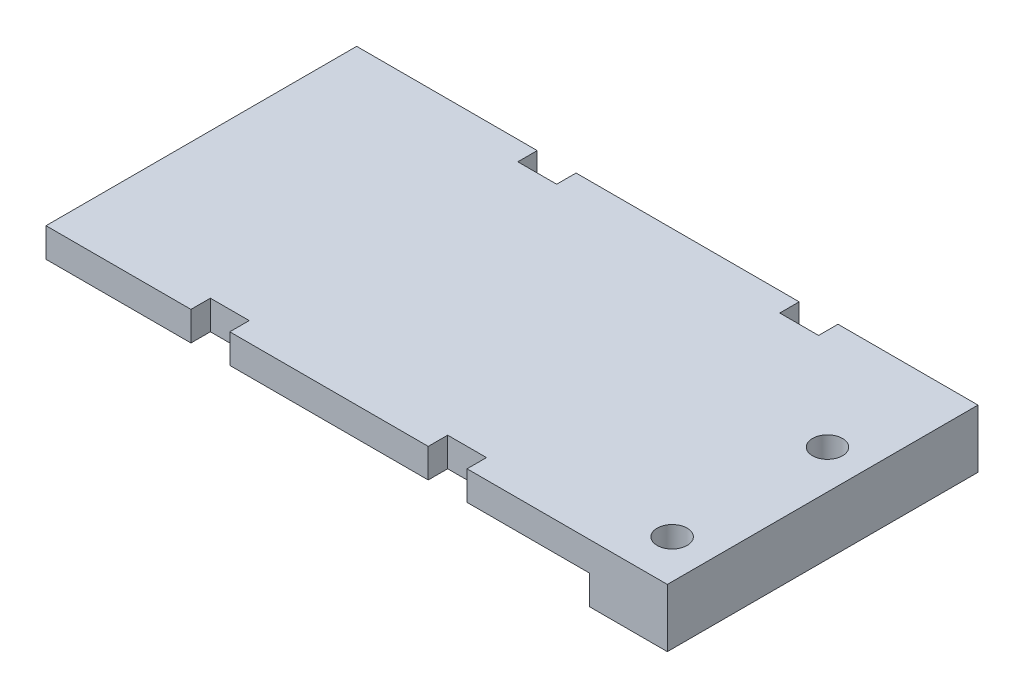
ISO-10303-21;
HEADER;
FILE_DESCRIPTION(('STEP AP214'),'2;1');
FILE_NAME('part.step','',(''),(''),'','','');
FILE_SCHEMA(('AUTOMOTIVE_DESIGN { 1 0 10303 214 1 1 1 1 }'));
ENDSEC;
DATA;
#1=APPLICATION_CONTEXT('core data for automotive mechanical design processes');
#2=APPLICATION_PROTOCOL_DEFINITION('international standard','automotive_design',2000,#1);
#3=PRODUCT_CONTEXT('',#1,'mechanical');
#4=PRODUCT('Part','Part','',(#3));
#5=PRODUCT_RELATED_PRODUCT_CATEGORY('part','',(#4));
#6=PRODUCT_DEFINITION_FORMATION('','',#4);
#7=PRODUCT_DEFINITION_CONTEXT('part definition',#1,'design');
#8=PRODUCT_DEFINITION('design','',#6,#7);
#9=PRODUCT_DEFINITION_SHAPE('','',#8);
#10=(LENGTH_UNIT() NAMED_UNIT(*) SI_UNIT(.MILLI.,.METRE.));
#11=(NAMED_UNIT(*) PLANE_ANGLE_UNIT() SI_UNIT($,.RADIAN.));
#12=(NAMED_UNIT(*) SI_UNIT($,.STERADIAN.) SOLID_ANGLE_UNIT());
#13=UNCERTAINTY_MEASURE_WITH_UNIT(LENGTH_MEASURE(1.E-05),#10,'distance_accuracy_value','');
#14=(GEOMETRIC_REPRESENTATION_CONTEXT(3) GLOBAL_UNCERTAINTY_ASSIGNED_CONTEXT((#13)) GLOBAL_UNIT_ASSIGNED_CONTEXT((#10,
#11,#12)) REPRESENTATION_CONTEXT('',''));
#15=CARTESIAN_POINT('',(0.,0.,0.));
#16=DIRECTION('',(0.,0.,1.));
#17=DIRECTION('',(1.,0.,0.));
#18=AXIS2_PLACEMENT_3D('',#15,#16,#17);
#19=CARTESIAN_POINT('',(-50.8,4.7625,-25.4));
#20=DIRECTION('',(0.,0.,1.));
#21=DIRECTION('',(1.,0.,0.));
#22=AXIS2_PLACEMENT_3D('',#19,#20,#21);
#23=PLANE('',#22);
#24=DIRECTION('',(-1.,0.,0.));
#25=VECTOR('',#24,1.);
#26=CARTESIAN_POINT('',(-50.8,4.7625,-25.4));
#27=LINE('',#26,#25);
#28=CARTESIAN_POINT('',(21.5569089687596,4.7625,-25.4));
#29=VERTEX_POINT('',#28);
#30=CARTESIAN_POINT('',(-14.9241712665832,4.7625,-25.4));
#31=VERTEX_POINT('',#30);
#32=EDGE_CURVE('E309',#29,#31,#27,.T.);
#33=ORIENTED_EDGE('',*,*,#32,.F.);
#34=DIRECTION('',(0.,1.,0.));
#35=VECTOR('',#34,1.);
#36=CARTESIAN_POINT('',(21.5569089687596,-4.7625,-25.4));
#37=LINE('',#36,#35);
#38=CARTESIAN_POINT('',(21.5569089687596,0.,-25.4));
#39=VERTEX_POINT('',#38);
#40=EDGE_CURVE('E205',#39,#29,#37,.T.);
#41=ORIENTED_EDGE('',*,*,#40,.F.);
#42=DIRECTION('',(-1.,0.,0.));
#43=VECTOR('',#42,1.);
#44=CARTESIAN_POINT('',(-50.8,0.,-25.4));
#45=LINE('',#44,#43);
#46=CARTESIAN_POINT('',(-14.9241712665832,0.,-25.4));
#47=VERTEX_POINT('',#46);
#48=EDGE_CURVE('E321',#39,#47,#45,.T.);
#49=ORIENTED_EDGE('',*,*,#48,.T.);
#50=DIRECTION('',(0.,1.,0.));
#51=VECTOR('',#50,1.);
#52=CARTESIAN_POINT('',(-14.9241712665832,-4.7625,-25.4));
#53=LINE('',#52,#51);
#54=EDGE_CURVE('E226',#47,#31,#53,.T.);
#55=ORIENTED_EDGE('',*,*,#54,.T.);
#56=EDGE_LOOP('',(#33,#41,#49,#55));
#57=FACE_BOUND('',#56,.T.);
#58=ADVANCED_FACE('F43',(#57),#23,.F.);
#59=CARTESIAN_POINT('',(-21.2741712665832,4.7625,-25.4));
#60=VERTEX_POINT('',#59);
#61=CARTESIAN_POINT('',(-50.8,4.7625,-25.4));
#62=VERTEX_POINT('',#61);
#63=EDGE_CURVE('E304',#60,#62,#27,.T.);
#64=ORIENTED_EDGE('',*,*,#63,.F.);
#65=DIRECTION('',(0.,1.,0.));
#66=VECTOR('',#65,1.);
#67=CARTESIAN_POINT('',(-21.2741712665832,-4.7625,-25.4));
#68=LINE('',#67,#66);
#69=CARTESIAN_POINT('',(-21.2741712665832,0.,-25.4));
#70=VERTEX_POINT('',#69);
#71=EDGE_CURVE('E229',#70,#60,#68,.T.);
#72=ORIENTED_EDGE('',*,*,#71,.F.);
#73=CARTESIAN_POINT('',(-50.8,0.,-25.4));
#74=VERTEX_POINT('',#73);
#75=EDGE_CURVE('E300',#70,#74,#45,.T.);
#76=ORIENTED_EDGE('',*,*,#75,.T.);
#77=DIRECTION('',(0.,-1.,0.));
#78=VECTOR('',#77,1.);
#79=CARTESIAN_POINT('',(-50.8,4.7625,-25.4));
#80=LINE('',#79,#78);
#81=EDGE_CURVE('E331',#62,#74,#80,.T.);
#82=ORIENTED_EDGE('',*,*,#81,.F.);
#83=EDGE_LOOP('',(#64,#72,#76,#82));
#84=FACE_BOUND('',#83,.T.);
#85=ADVANCED_FACE('F374',(#84),#23,.F.);
#86=CARTESIAN_POINT('',(-50.8,4.7625,25.4));
#87=DIRECTION('',(0.,0.,-1.));
#88=DIRECTION('',(-1.,0.,0.));
#89=AXIS2_PLACEMENT_3D('',#86,#87,#88);
#90=PLANE('',#89);
#91=DIRECTION('',(1.,0.,0.));
#92=VECTOR('',#91,1.);
#93=CARTESIAN_POINT('',(-50.8,0.,25.4));
#94=LINE('',#93,#92);
#95=CARTESIAN_POINT('',(-50.8,0.,25.4));
#96=VERTEX_POINT('',#95);
#97=CARTESIAN_POINT('',(-27.0964168163298,0.,25.4));
#98=VERTEX_POINT('',#97);
#99=EDGE_CURVE('E305',#96,#98,#94,.T.);
#100=ORIENTED_EDGE('',*,*,#99,.T.);
#101=DIRECTION('',(0.,1.,0.));
#102=VECTOR('',#101,1.);
#103=CARTESIAN_POINT('',(-27.0964168163298,-4.7625,25.4));
#104=LINE('',#103,#102);
#105=CARTESIAN_POINT('',(-27.0964168163298,4.7625,25.4));
#106=VERTEX_POINT('',#105);
#107=EDGE_CURVE('E237',#98,#106,#104,.T.);
#108=ORIENTED_EDGE('',*,*,#107,.T.);
#109=DIRECTION('',(1.,0.,0.));
#110=VECTOR('',#109,1.);
#111=CARTESIAN_POINT('',(-50.8,4.7625,25.4));
#112=LINE('',#111,#110);
#113=CARTESIAN_POINT('',(-50.8,4.7625,25.4));
#114=VERTEX_POINT('',#113);
#115=EDGE_CURVE('E312',#114,#106,#112,.T.);
#116=ORIENTED_EDGE('',*,*,#115,.F.);
#117=DIRECTION('',(0.,-1.,0.));
#118=VECTOR('',#117,1.);
#119=CARTESIAN_POINT('',(-50.8,4.7625,25.4));
#120=LINE('',#119,#118);
#121=EDGE_CURVE('E328',#114,#96,#120,.T.);
#122=ORIENTED_EDGE('',*,*,#121,.T.);
#123=EDGE_LOOP('',(#100,#108,#116,#122));
#124=FACE_BOUND('',#123,.T.);
#125=ADVANCED_FACE('F382',(#124),#90,.F.);
#126=CARTESIAN_POINT('',(-20.7464168163298,4.7625,25.4));
#127=VERTEX_POINT('',#126);
#128=CARTESIAN_POINT('',(11.7031032476702,4.7625,25.4));
#129=VERTEX_POINT('',#128);
#130=EDGE_CURVE('E316',#127,#129,#112,.T.);
#131=ORIENTED_EDGE('',*,*,#130,.F.);
#132=DIRECTION('',(0.,1.,0.));
#133=VECTOR('',#132,1.);
#134=CARTESIAN_POINT('',(-20.7464168163298,-4.7625,25.4));
#135=LINE('',#134,#133);
#136=CARTESIAN_POINT('',(-20.7464168163298,0.,25.4));
#137=VERTEX_POINT('',#136);
#138=EDGE_CURVE('E241',#137,#127,#135,.T.);
#139=ORIENTED_EDGE('',*,*,#138,.F.);
#140=CARTESIAN_POINT('',(11.7031032476702,0.,25.4));
#141=VERTEX_POINT('',#140);
#142=EDGE_CURVE('E326',#137,#141,#94,.T.);
#143=ORIENTED_EDGE('',*,*,#142,.T.);
#144=DIRECTION('',(0.,1.,0.));
#145=VECTOR('',#144,1.);
#146=CARTESIAN_POINT('',(11.7031032476702,-4.7625,25.4));
#147=LINE('',#146,#145);
#148=EDGE_CURVE('E254',#141,#129,#147,.T.);
#149=ORIENTED_EDGE('',*,*,#148,.T.);
#150=EDGE_LOOP('',(#131,#139,#143,#149));
#151=FACE_BOUND('',#150,.T.);
#152=ADVANCED_FACE('F401',(#151),#90,.F.);
#153=CARTESIAN_POINT('',(50.8,4.7625,25.4));
#154=DIRECTION('',(-1.,0.,0.));
#155=DIRECTION('',(0.,0.,1.));
#156=AXIS2_PLACEMENT_3D('',#153,#154,#155);
#157=PLANE('',#156);
#158=DIRECTION('',(0.,-1.,0.));
#159=VECTOR('',#158,1.);
#160=CARTESIAN_POINT('',(50.8,4.7625,25.4));
#161=LINE('',#160,#159);
#162=CARTESIAN_POINT('',(50.8,4.7625,25.4));
#163=VERTEX_POINT('',#162);
#164=CARTESIAN_POINT('',(50.8,-4.7625,25.4));
#165=VERTEX_POINT('',#164);
#166=EDGE_CURVE('E315',#163,#165,#161,.T.);
#167=ORIENTED_EDGE('',*,*,#166,.T.);
#168=DIRECTION('',(0.,0.,1.));
#169=VECTOR('',#168,1.);
#170=CARTESIAN_POINT('',(50.8,-4.7625,25.4));
#171=LINE('',#170,#169);
#172=CARTESIAN_POINT('',(50.8,-4.7625,-25.4));
#173=VERTEX_POINT('',#172);
#174=EDGE_CURVE('E282',#173,#165,#171,.T.);
#175=ORIENTED_EDGE('',*,*,#174,.F.);
#176=DIRECTION('',(0.,-1.,0.));
#177=VECTOR('',#176,1.);
#178=CARTESIAN_POINT('',(50.8,4.7625,-25.4));
#179=LINE('',#178,#177);
#180=CARTESIAN_POINT('',(50.8,4.7625,-25.4));
#181=VERTEX_POINT('',#180);
#182=EDGE_CURVE('E334',#181,#173,#179,.T.);
#183=ORIENTED_EDGE('',*,*,#182,.F.);
#184=DIRECTION('',(0.,0.,-1.));
#185=VECTOR('',#184,1.);
#186=CARTESIAN_POINT('',(50.8,4.7625,25.4));
#187=LINE('',#186,#185);
#188=EDGE_CURVE('E301',#163,#181,#187,.T.);
#189=ORIENTED_EDGE('',*,*,#188,.F.);
#190=EDGE_LOOP('',(#167,#175,#183,#189));
#191=FACE_BOUND('',#190,.T.);
#192=ADVANCED_FACE('F45',(#191),#157,.F.);
#193=CARTESIAN_POINT('',(38.1,0.,-25.4));
#194=VERTEX_POINT('',#193);
#195=CARTESIAN_POINT('',(27.9069089687596,0.,-25.4));
#196=VERTEX_POINT('',#195);
#197=EDGE_CURVE('E317',#194,#196,#45,.T.);
#198=ORIENTED_EDGE('',*,*,#197,.T.);
#199=DIRECTION('',(0.,1.,0.));
#200=VECTOR('',#199,1.);
#201=CARTESIAN_POINT('',(27.9069089687596,-4.7625,-25.4));
#202=LINE('',#201,#200);
#203=CARTESIAN_POINT('',(27.9069089687596,4.7625,-25.4));
#204=VERTEX_POINT('',#203);
#205=EDGE_CURVE('E218',#196,#204,#202,.T.);
#206=ORIENTED_EDGE('',*,*,#205,.T.);
#207=EDGE_CURVE('E306',#181,#204,#27,.T.);
#208=ORIENTED_EDGE('',*,*,#207,.F.);
#209=ORIENTED_EDGE('',*,*,#182,.T.);
#210=DIRECTION('',(1.,0.,0.));
#211=VECTOR('',#210,1.);
#212=CARTESIAN_POINT('',(50.8,-4.7625,-25.4));
#213=LINE('',#212,#211);
#214=CARTESIAN_POINT('',(38.1,-4.7625,-25.4));
#215=VERTEX_POINT('',#214);
#216=EDGE_CURVE('E289',#215,#173,#213,.T.);
#217=ORIENTED_EDGE('',*,*,#216,.F.);
#218=DIRECTION('',(0.,1.,0.));
#219=VECTOR('',#218,1.);
#220=CARTESIAN_POINT('',(38.1,-4.7625,-25.4));
#221=LINE('',#220,#219);
#222=EDGE_CURVE('E292',#215,#194,#221,.T.);
#223=ORIENTED_EDGE('',*,*,#222,.T.);
#224=EDGE_LOOP('',(#198,#206,#208,#209,#217,#223));
#225=FACE_BOUND('',#224,.T.);
#226=ADVANCED_FACE('F419',(#225),#23,.F.);
#227=CARTESIAN_POINT('',(-50.8,4.7625,25.4));
#228=DIRECTION('',(1.,0.,0.));
#229=DIRECTION('',(0.,0.,-1.));
#230=AXIS2_PLACEMENT_3D('',#227,#228,#229);
#231=PLANE('',#230);
#232=DIRECTION('',(0.,0.,1.));
#233=VECTOR('',#232,1.);
#234=CARTESIAN_POINT('',(-50.8,0.,25.4));
#235=LINE('',#234,#233);
#236=EDGE_CURVE('E320',#74,#96,#235,.T.);
#237=ORIENTED_EDGE('',*,*,#236,.T.);
#238=ORIENTED_EDGE('',*,*,#121,.F.);
#239=DIRECTION('',(0.,0.,1.));
#240=VECTOR('',#239,1.);
#241=CARTESIAN_POINT('',(-50.8,4.7625,25.4));
#242=LINE('',#241,#240);
#243=EDGE_CURVE('E308',#62,#114,#242,.T.);
#244=ORIENTED_EDGE('',*,*,#243,.F.);
#245=ORIENTED_EDGE('',*,*,#81,.T.);
#246=EDGE_LOOP('',(#237,#238,#244,#245));
#247=FACE_BOUND('',#246,.T.);
#248=ADVANCED_FACE('F378',(#247),#231,.F.);
#249=CARTESIAN_POINT('',(18.0531032476702,4.7625,25.4));
#250=VERTEX_POINT('',#249);
#251=EDGE_CURVE('E311',#250,#163,#112,.T.);
#252=ORIENTED_EDGE('',*,*,#251,.F.);
#253=DIRECTION('',(0.,1.,0.));
#254=VECTOR('',#253,1.);
#255=CARTESIAN_POINT('',(18.0531032476702,-4.7625,25.4));
#256=LINE('',#255,#254);
#257=CARTESIAN_POINT('',(18.0531032476702,0.,25.4));
#258=VERTEX_POINT('',#257);
#259=EDGE_CURVE('E258',#258,#250,#256,.T.);
#260=ORIENTED_EDGE('',*,*,#259,.F.);
#261=CARTESIAN_POINT('',(38.1,0.,25.4));
#262=VERTEX_POINT('',#261);
#263=EDGE_CURVE('E323',#258,#262,#94,.T.);
#264=ORIENTED_EDGE('',*,*,#263,.T.);
#265=DIRECTION('',(0.,1.,0.));
#266=VECTOR('',#265,1.);
#267=CARTESIAN_POINT('',(38.1,-4.7625,25.4));
#268=LINE('',#267,#266);
#269=CARTESIAN_POINT('',(38.1,-4.7625,25.4));
#270=VERTEX_POINT('',#269);
#271=EDGE_CURVE('E297',#270,#262,#268,.T.);
#272=ORIENTED_EDGE('',*,*,#271,.F.);
#273=DIRECTION('',(-1.,0.,0.));
#274=VECTOR('',#273,1.);
#275=CARTESIAN_POINT('',(50.8,-4.7625,25.4));
#276=LINE('',#275,#274);
#277=EDGE_CURVE('E285',#165,#270,#276,.T.);
#278=ORIENTED_EDGE('',*,*,#277,.F.);
#279=ORIENTED_EDGE('',*,*,#166,.F.);
#280=EDGE_LOOP('',(#252,#260,#264,#272,#278,#279));
#281=FACE_BOUND('',#280,.T.);
#282=ADVANCED_FACE('F413',(#281),#90,.F.);
#283=CARTESIAN_POINT('',(0.,4.7625,0.));
#284=DIRECTION('',(0.,-1.,0.));
#285=DIRECTION('',(0.,0.,-1.));
#286=AXIS2_PLACEMENT_3D('',#283,#284,#285);
#287=PLANE('',#286);
#288=CARTESIAN_POINT('',(44.4500000000017,4.7625,-7.13930500000055));
#289=DIRECTION('',(0.,1.,0.));
#290=DIRECTION('',(0.,0.,1.));
#291=AXIS2_PLACEMENT_3D('',#288,#289,#290);
#292=CIRCLE('',#291,2.45745);
#293=CARTESIAN_POINT('',(44.4500000000017,4.7625,-4.68185500000055));
#294=VERTEX_POINT('',#293);
#295=EDGE_CURVE('E217',#294,#294,#292,.T.);
#296=ORIENTED_EDGE('',*,*,#295,.F.);
#297=EDGE_LOOP('',(#296));
#298=FACE_BOUND('',#297,.T.);
#299=CARTESIAN_POINT('',(44.4500000000017,4.7625,18.2606949999995));
#300=DIRECTION('',(0.,1.,0.));
#301=DIRECTION('',(0.,0.,1.));
#302=AXIS2_PLACEMENT_3D('',#299,#300,#301);
#303=CIRCLE('',#302,2.45745);
#304=CARTESIAN_POINT('',(44.4500000000017,4.7625,20.7181449999995));
#305=VERTEX_POINT('',#304);
#306=EDGE_CURVE('E275',#305,#305,#303,.T.);
#307=ORIENTED_EDGE('',*,*,#306,.F.);
#308=EDGE_LOOP('',(#307));
#309=FACE_BOUND('',#308,.T.);
#310=DIRECTION('',(1.,0.,0.));
#311=VECTOR('',#310,1.);
#312=CARTESIAN_POINT('',(21.5569089687596,4.7625,-22.225));
#313=LINE('',#312,#311);
#314=CARTESIAN_POINT('',(21.5569089687596,4.7625,-22.225));
#315=VERTEX_POINT('',#314);
#316=CARTESIAN_POINT('',(27.9069089687596,4.7625,-22.225));
#317=VERTEX_POINT('',#316);
#318=EDGE_CURVE('E193',#315,#317,#313,.T.);
#319=ORIENTED_EDGE('',*,*,#318,.F.);
#320=DIRECTION('',(0.,0.,1.));
#321=VECTOR('',#320,1.);
#322=CARTESIAN_POINT('',(21.5569089687596,4.7625,-25.4));
#323=LINE('',#322,#321);
#324=EDGE_CURVE('E202',#29,#315,#323,.T.);
#325=ORIENTED_EDGE('',*,*,#324,.F.);
#326=ORIENTED_EDGE('',*,*,#32,.T.);
#327=DIRECTION('',(0.,0.,-1.));
#328=VECTOR('',#327,1.);
#329=CARTESIAN_POINT('',(-14.9241712665832,4.7625,-25.4));
#330=LINE('',#329,#328);
#331=CARTESIAN_POINT('',(-14.9241712665832,4.7625,-22.225));
#332=VERTEX_POINT('',#331);
#333=EDGE_CURVE('E224',#332,#31,#330,.T.);
#334=ORIENTED_EDGE('',*,*,#333,.F.);
#335=DIRECTION('',(1.,0.,0.));
#336=VECTOR('',#335,1.);
#337=CARTESIAN_POINT('',(-21.2741712665832,4.7625,-22.225));
#338=LINE('',#337,#336);
#339=CARTESIAN_POINT('',(-21.2741712665832,4.7625,-22.225));
#340=VERTEX_POINT('',#339);
#341=EDGE_CURVE('E233',#340,#332,#338,.T.);
#342=ORIENTED_EDGE('',*,*,#341,.F.);
#343=DIRECTION('',(0.,0.,1.));
#344=VECTOR('',#343,1.);
#345=CARTESIAN_POINT('',(-21.2741712665832,4.7625,-25.4));
#346=LINE('',#345,#344);
#347=EDGE_CURVE('E209',#60,#340,#346,.T.);
#348=ORIENTED_EDGE('',*,*,#347,.F.);
#349=ORIENTED_EDGE('',*,*,#63,.T.);
#350=ORIENTED_EDGE('',*,*,#243,.T.);
#351=ORIENTED_EDGE('',*,*,#115,.T.);
#352=DIRECTION('',(0.,0.,1.));
#353=VECTOR('',#352,1.);
#354=CARTESIAN_POINT('',(-27.0964168163298,4.7625,25.4));
#355=LINE('',#354,#353);
#356=CARTESIAN_POINT('',(-27.0964168163298,4.7625,22.225));
#357=VERTEX_POINT('',#356);
#358=EDGE_CURVE('E231',#357,#106,#355,.T.);
#359=ORIENTED_EDGE('',*,*,#358,.F.);
#360=DIRECTION('',(-1.,0.,0.));
#361=VECTOR('',#360,1.);
#362=CARTESIAN_POINT('',(-27.0964168163298,4.7625,22.225));
#363=LINE('',#362,#361);
#364=CARTESIAN_POINT('',(-20.7464168163298,4.7625,22.225));
#365=VERTEX_POINT('',#364);
#366=EDGE_CURVE('E240',#365,#357,#363,.T.);
#367=ORIENTED_EDGE('',*,*,#366,.F.);
#368=DIRECTION('',(0.,0.,-1.));
#369=VECTOR('',#368,1.);
#370=CARTESIAN_POINT('',(-20.7464168163298,4.7625,25.4));
#371=LINE('',#370,#369);
#372=EDGE_CURVE('E250',#127,#365,#371,.T.);
#373=ORIENTED_EDGE('',*,*,#372,.F.);
#374=ORIENTED_EDGE('',*,*,#130,.T.);
#375=DIRECTION('',(0.,0.,1.));
#376=VECTOR('',#375,1.);
#377=CARTESIAN_POINT('',(11.7031032476702,4.7625,25.4));
#378=LINE('',#377,#376);
#379=CARTESIAN_POINT('',(11.7031032476702,4.7625,22.225));
#380=VERTEX_POINT('',#379);
#381=EDGE_CURVE('E247',#380,#129,#378,.T.);
#382=ORIENTED_EDGE('',*,*,#381,.F.);
#383=DIRECTION('',(-1.,0.,0.));
#384=VECTOR('',#383,1.);
#385=CARTESIAN_POINT('',(11.7031032476702,4.7625,22.225));
#386=LINE('',#385,#384);
#387=CARTESIAN_POINT('',(18.0531032476702,4.7625,22.225));
#388=VERTEX_POINT('',#387);
#389=EDGE_CURVE('E257',#388,#380,#386,.T.);
#390=ORIENTED_EDGE('',*,*,#389,.F.);
#391=DIRECTION('',(0.,0.,-1.));
#392=VECTOR('',#391,1.);
#393=CARTESIAN_POINT('',(18.0531032476702,4.7625,25.4));
#394=LINE('',#393,#392);
#395=EDGE_CURVE('E266',#250,#388,#394,.T.);
#396=ORIENTED_EDGE('',*,*,#395,.F.);
#397=ORIENTED_EDGE('',*,*,#251,.T.);
#398=ORIENTED_EDGE('',*,*,#188,.T.);
#399=ORIENTED_EDGE('',*,*,#207,.T.);
#400=DIRECTION('',(0.,0.,-1.));
#401=VECTOR('',#400,1.);
#402=CARTESIAN_POINT('',(27.9069089687596,4.7625,-25.4));
#403=LINE('',#402,#401);
#404=EDGE_CURVE('E199',#317,#204,#403,.T.);
#405=ORIENTED_EDGE('',*,*,#404,.F.);
#406=EDGE_LOOP('',(#319,#325,#326,#334,#342,#348,#349,#350,#351,#359,#367,#373,#374,#382,#390,
#396,#397,#398,#399,#405));
#407=FACE_BOUND('',#406,.T.);
#408=ADVANCED_FACE('F211',(#298,#309,#407),#287,.F.);
#409=CARTESIAN_POINT('',(0.,0.,0.));
#410=DIRECTION('',(0.,-1.,0.));
#411=DIRECTION('',(0.,0.,-1.));
#412=AXIS2_PLACEMENT_3D('',#409,#410,#411);
#413=PLANE('',#412);
#414=DIRECTION('',(0.,0.,-1.));
#415=VECTOR('',#414,1.);
#416=CARTESIAN_POINT('',(21.5569089687596,0.,0.));
#417=LINE('',#416,#415);
#418=CARTESIAN_POINT('',(21.5569089687596,0.,-22.225));
#419=VERTEX_POINT('',#418);
#420=EDGE_CURVE('E11',#419,#39,#417,.T.);
#421=ORIENTED_EDGE('',*,*,#420,.F.);
#422=DIRECTION('',(-1.,0.,0.));
#423=VECTOR('',#422,1.);
#424=CARTESIAN_POINT('',(0.,0.,-22.225));
#425=LINE('',#424,#423);
#426=CARTESIAN_POINT('',(27.9069089687596,0.,-22.225));
#427=VERTEX_POINT('',#426);
#428=EDGE_CURVE('E196',#427,#419,#425,.T.);
#429=ORIENTED_EDGE('',*,*,#428,.F.);
#430=DIRECTION('',(0.,0.,1.));
#431=VECTOR('',#430,1.);
#432=CARTESIAN_POINT('',(27.9069089687596,0.,0.));
#433=LINE('',#432,#431);
#434=EDGE_CURVE('E51',#196,#427,#433,.T.);
#435=ORIENTED_EDGE('',*,*,#434,.F.);
#436=ORIENTED_EDGE('',*,*,#197,.F.);
#437=DIRECTION('',(0.,0.,-1.));
#438=VECTOR('',#437,1.);
#439=CARTESIAN_POINT('',(38.1,0.,25.4));
#440=LINE('',#439,#438);
#441=EDGE_CURVE('E281',#262,#194,#440,.T.);
#442=ORIENTED_EDGE('',*,*,#441,.F.);
#443=ORIENTED_EDGE('',*,*,#263,.F.);
#444=DIRECTION('',(0.,0.,1.));
#445=VECTOR('',#444,1.);
#446=CARTESIAN_POINT('',(18.0531032476702,0.,0.));
#447=LINE('',#446,#445);
#448=CARTESIAN_POINT('',(18.0531032476702,0.,22.225));
#449=VERTEX_POINT('',#448);
#450=EDGE_CURVE('E336',#449,#258,#447,.T.);
#451=ORIENTED_EDGE('',*,*,#450,.F.);
#452=DIRECTION('',(1.,0.,0.));
#453=VECTOR('',#452,1.);
#454=CARTESIAN_POINT('',(0.,0.,22.225));
#455=LINE('',#454,#453);
#456=CARTESIAN_POINT('',(11.7031032476702,0.,22.225));
#457=VERTEX_POINT('',#456);
#458=EDGE_CURVE('E338',#457,#449,#455,.T.);
#459=ORIENTED_EDGE('',*,*,#458,.F.);
#460=DIRECTION('',(0.,0.,-1.));
#461=VECTOR('',#460,1.);
#462=CARTESIAN_POINT('',(11.7031032476701,0.,0.));
#463=LINE('',#462,#461);
#464=EDGE_CURVE('E341',#141,#457,#463,.T.);
#465=ORIENTED_EDGE('',*,*,#464,.F.);
#466=ORIENTED_EDGE('',*,*,#142,.F.);
#467=DIRECTION('',(0.,0.,1.));
#468=VECTOR('',#467,1.);
#469=CARTESIAN_POINT('',(-20.7464168163298,0.,0.));
#470=LINE('',#469,#468);
#471=CARTESIAN_POINT('',(-20.7464168163298,0.,22.225));
#472=VERTEX_POINT('',#471);
#473=EDGE_CURVE('E343',#472,#137,#470,.T.);
#474=ORIENTED_EDGE('',*,*,#473,.F.);
#475=DIRECTION('',(1.,0.,0.));
#476=VECTOR('',#475,1.);
#477=CARTESIAN_POINT('',(0.,0.,22.225));
#478=LINE('',#477,#476);
#479=CARTESIAN_POINT('',(-27.0964168163298,0.,22.225));
#480=VERTEX_POINT('',#479);
#481=EDGE_CURVE('E345',#480,#472,#478,.T.);
#482=ORIENTED_EDGE('',*,*,#481,.F.);
#483=DIRECTION('',(0.,0.,-1.));
#484=VECTOR('',#483,1.);
#485=CARTESIAN_POINT('',(-27.0964168163298,0.,0.));
#486=LINE('',#485,#484);
#487=EDGE_CURVE('E348',#98,#480,#486,.T.);
#488=ORIENTED_EDGE('',*,*,#487,.F.);
#489=ORIENTED_EDGE('',*,*,#99,.F.);
#490=ORIENTED_EDGE('',*,*,#236,.F.);
#491=ORIENTED_EDGE('',*,*,#75,.F.);
#492=DIRECTION('',(0.,0.,-1.));
#493=VECTOR('',#492,1.);
#494=CARTESIAN_POINT('',(-21.2741712665832,0.,0.));
#495=LINE('',#494,#493);
#496=CARTESIAN_POINT('',(-21.2741712665832,0.,-22.225));
#497=VERTEX_POINT('',#496);
#498=EDGE_CURVE('E354',#497,#70,#495,.T.);
#499=ORIENTED_EDGE('',*,*,#498,.F.);
#500=DIRECTION('',(-1.,0.,0.));
#501=VECTOR('',#500,1.);
#502=CARTESIAN_POINT('',(0.,0.,-22.225));
#503=LINE('',#502,#501);
#504=CARTESIAN_POINT('',(-14.9241712665832,0.,-22.225));
#505=VERTEX_POINT('',#504);
#506=EDGE_CURVE('E350',#505,#497,#503,.T.);
#507=ORIENTED_EDGE('',*,*,#506,.F.);
#508=DIRECTION('',(0.,0.,1.));
#509=VECTOR('',#508,1.);
#510=CARTESIAN_POINT('',(-14.9241712665832,0.,0.));
#511=LINE('',#510,#509);
#512=EDGE_CURVE('E352',#47,#505,#511,.T.);
#513=ORIENTED_EDGE('',*,*,#512,.F.);
#514=ORIENTED_EDGE('',*,*,#48,.F.);
#515=EDGE_LOOP('',(#421,#429,#435,#436,#442,#443,#451,#459,#465,#466,#474,#482,#488,#489,#490,
#491,#499,#507,#513,#514));
#516=FACE_BOUND('',#515,.T.);
#517=ADVANCED_FACE('F360',(#516),#413,.T.);
#518=CARTESIAN_POINT('',(38.1,-4.7625,25.4));
#519=DIRECTION('',(1.,0.,0.));
#520=DIRECTION('',(0.,0.,-1.));
#521=AXIS2_PLACEMENT_3D('',#518,#519,#520);
#522=PLANE('',#521);
#523=ORIENTED_EDGE('',*,*,#441,.T.);
#524=ORIENTED_EDGE('',*,*,#222,.F.);
#525=DIRECTION('',(0.,0.,-1.));
#526=VECTOR('',#525,1.);
#527=CARTESIAN_POINT('',(38.1,-4.7625,25.4));
#528=LINE('',#527,#526);
#529=EDGE_CURVE('E287',#270,#215,#528,.T.);
#530=ORIENTED_EDGE('',*,*,#529,.F.);
#531=ORIENTED_EDGE('',*,*,#271,.T.);
#532=EDGE_LOOP('',(#523,#524,#530,#531));
#533=FACE_BOUND('',#532,.T.);
#534=ADVANCED_FACE('F425',(#533),#522,.F.);
#535=CARTESIAN_POINT('',(0.,-4.7625,0.));
#536=DIRECTION('',(0.,1.,0.));
#537=DIRECTION('',(0.,0.,1.));
#538=AXIS2_PLACEMENT_3D('',#535,#536,#537);
#539=PLANE('',#538);
#540=CARTESIAN_POINT('',(44.4500000000017,-4.7625,-7.13930500000055));
#541=DIRECTION('',(0.,1.,0.));
#542=DIRECTION('',(0.,0.,1.));
#543=AXIS2_PLACEMENT_3D('',#540,#541,#542);
#544=CIRCLE('',#543,2.45745);
#545=CARTESIAN_POINT('',(44.4500000000017,-4.7625,-4.68185500000055));
#546=VERTEX_POINT('',#545);
#547=EDGE_CURVE('E272',#546,#546,#544,.T.);
#548=ORIENTED_EDGE('',*,*,#547,.T.);
#549=EDGE_LOOP('',(#548));
#550=FACE_BOUND('',#549,.T.);
#551=CARTESIAN_POINT('',(44.4500000000017,-4.7625,18.2606949999995));
#552=DIRECTION('',(0.,1.,0.));
#553=DIRECTION('',(0.,0.,1.));
#554=AXIS2_PLACEMENT_3D('',#551,#552,#553);
#555=CIRCLE('',#554,2.45745);
#556=CARTESIAN_POINT('',(44.4500000000017,-4.7625,20.7181449999995));
#557=VERTEX_POINT('',#556);
#558=EDGE_CURVE('E278',#557,#557,#555,.T.);
#559=ORIENTED_EDGE('',*,*,#558,.T.);
#560=EDGE_LOOP('',(#559));
#561=FACE_BOUND('',#560,.T.);
#562=ORIENTED_EDGE('',*,*,#174,.T.);
#563=ORIENTED_EDGE('',*,*,#277,.T.);
#564=ORIENTED_EDGE('',*,*,#529,.T.);
#565=ORIENTED_EDGE('',*,*,#216,.T.);
#566=EDGE_LOOP('',(#562,#563,#564,#565));
#567=FACE_BOUND('',#566,.T.);
#568=ADVANCED_FACE('F421',(#550,#561,#567),#539,.F.);
#569=CARTESIAN_POINT('',(44.4500000000017,4.7625,18.2606949999995));
#570=DIRECTION('',(0.,1.,0.));
#571=DIRECTION('',(0.,0.,1.));
#572=AXIS2_PLACEMENT_3D('',#569,#570,#571);
#573=CYLINDRICAL_SURFACE('',#572,2.45745);
#574=ORIENTED_EDGE('',*,*,#558,.F.);
#575=EDGE_LOOP('',(#574));
#576=FACE_BOUND('',#575,.T.);
#577=ORIENTED_EDGE('',*,*,#306,.T.);
#578=EDGE_LOOP('',(#577));
#579=FACE_BOUND('',#578,.T.);
#580=ADVANCED_FACE('F482',(#576,#579),#573,.F.);
#581=CARTESIAN_POINT('',(44.4500000000017,4.7625,-7.13930500000055));
#582=DIRECTION('',(0.,1.,0.));
#583=DIRECTION('',(0.,0.,1.));
#584=AXIS2_PLACEMENT_3D('',#581,#582,#583);
#585=CYLINDRICAL_SURFACE('',#584,2.45745);
#586=ORIENTED_EDGE('',*,*,#547,.F.);
#587=EDGE_LOOP('',(#586));
#588=FACE_BOUND('',#587,.T.);
#589=ORIENTED_EDGE('',*,*,#295,.T.);
#590=EDGE_LOOP('',(#589));
#591=FACE_BOUND('',#590,.T.);
#592=ADVANCED_FACE('F486',(#588,#591),#585,.F.);
#593=CARTESIAN_POINT('',(11.7031032476702,-4.7625,25.4));
#594=DIRECTION('',(-1.,0.,0.));
#595=DIRECTION('',(0.,0.,1.));
#596=AXIS2_PLACEMENT_3D('',#593,#594,#595);
#597=PLANE('',#596);
#598=ORIENTED_EDGE('',*,*,#464,.T.);
#599=DIRECTION('',(0.,1.,0.));
#600=VECTOR('',#599,1.);
#601=CARTESIAN_POINT('',(11.7031032476702,-4.7625,22.225));
#602=LINE('',#601,#600);
#603=EDGE_CURVE('E262',#457,#380,#602,.T.);
#604=ORIENTED_EDGE('',*,*,#603,.T.);
#605=ORIENTED_EDGE('',*,*,#381,.T.);
#606=ORIENTED_EDGE('',*,*,#148,.F.);
#607=EDGE_LOOP('',(#598,#604,#605,#606));
#608=FACE_BOUND('',#607,.T.);
#609=ADVANCED_FACE('F433',(#608),#597,.F.);
#610=CARTESIAN_POINT('',(11.7031032476702,-4.7625,22.225));
#611=DIRECTION('',(0.,0.,-1.));
#612=DIRECTION('',(-1.,0.,0.));
#613=AXIS2_PLACEMENT_3D('',#610,#611,#612);
#614=PLANE('',#613);
#615=ORIENTED_EDGE('',*,*,#458,.T.);
#616=DIRECTION('',(0.,1.,0.));
#617=VECTOR('',#616,1.);
#618=CARTESIAN_POINT('',(18.0531032476702,-4.7625,22.225));
#619=LINE('',#618,#617);
#620=EDGE_CURVE('E260',#449,#388,#619,.T.);
#621=ORIENTED_EDGE('',*,*,#620,.T.);
#622=ORIENTED_EDGE('',*,*,#389,.T.);
#623=ORIENTED_EDGE('',*,*,#603,.F.);
#624=EDGE_LOOP('',(#615,#621,#622,#623));
#625=FACE_BOUND('',#624,.T.);
#626=ADVANCED_FACE('F435',(#625),#614,.F.);
#627=CARTESIAN_POINT('',(18.0531032476702,-4.7625,25.4));
#628=DIRECTION('',(1.,0.,0.));
#629=DIRECTION('',(0.,0.,-1.));
#630=AXIS2_PLACEMENT_3D('',#627,#628,#629);
#631=PLANE('',#630);
#632=ORIENTED_EDGE('',*,*,#450,.T.);
#633=ORIENTED_EDGE('',*,*,#259,.T.);
#634=ORIENTED_EDGE('',*,*,#395,.T.);
#635=ORIENTED_EDGE('',*,*,#620,.F.);
#636=EDGE_LOOP('',(#632,#633,#634,#635));
#637=FACE_BOUND('',#636,.T.);
#638=ADVANCED_FACE('F437',(#637),#631,.F.);
#639=CARTESIAN_POINT('',(-27.0964168163298,-4.7625,25.4));
#640=DIRECTION('',(-1.,0.,0.));
#641=DIRECTION('',(0.,0.,1.));
#642=AXIS2_PLACEMENT_3D('',#639,#640,#641);
#643=PLANE('',#642);
#644=ORIENTED_EDGE('',*,*,#487,.T.);
#645=DIRECTION('',(0.,1.,0.));
#646=VECTOR('',#645,1.);
#647=CARTESIAN_POINT('',(-27.0964168163298,-4.7625,22.225));
#648=LINE('',#647,#646);
#649=EDGE_CURVE('E245',#480,#357,#648,.T.);
#650=ORIENTED_EDGE('',*,*,#649,.T.);
#651=ORIENTED_EDGE('',*,*,#358,.T.);
#652=ORIENTED_EDGE('',*,*,#107,.F.);
#653=EDGE_LOOP('',(#644,#650,#651,#652));
#654=FACE_BOUND('',#653,.T.);
#655=ADVANCED_FACE('F387',(#654),#643,.F.);
#656=CARTESIAN_POINT('',(-27.0964168163298,-4.7625,22.225));
#657=DIRECTION('',(0.,0.,-1.));
#658=DIRECTION('',(-1.,0.,0.));
#659=AXIS2_PLACEMENT_3D('',#656,#657,#658);
#660=PLANE('',#659);
#661=ORIENTED_EDGE('',*,*,#481,.T.);
#662=DIRECTION('',(0.,1.,0.));
#663=VECTOR('',#662,1.);
#664=CARTESIAN_POINT('',(-20.7464168163298,-4.7625,22.225));
#665=LINE('',#664,#663);
#666=EDGE_CURVE('E243',#472,#365,#665,.T.);
#667=ORIENTED_EDGE('',*,*,#666,.T.);
#668=ORIENTED_EDGE('',*,*,#366,.T.);
#669=ORIENTED_EDGE('',*,*,#649,.F.);
#670=EDGE_LOOP('',(#661,#667,#668,#669));
#671=FACE_BOUND('',#670,.T.);
#672=ADVANCED_FACE('F392',(#671),#660,.F.);
#673=CARTESIAN_POINT('',(-20.7464168163298,-4.7625,25.4));
#674=DIRECTION('',(1.,0.,0.));
#675=DIRECTION('',(0.,0.,-1.));
#676=AXIS2_PLACEMENT_3D('',#673,#674,#675);
#677=PLANE('',#676);
#678=ORIENTED_EDGE('',*,*,#473,.T.);
#679=ORIENTED_EDGE('',*,*,#138,.T.);
#680=ORIENTED_EDGE('',*,*,#372,.T.);
#681=ORIENTED_EDGE('',*,*,#666,.F.);
#682=EDGE_LOOP('',(#678,#679,#680,#681));
#683=FACE_BOUND('',#682,.T.);
#684=ADVANCED_FACE('F395',(#683),#677,.F.);
#685=CARTESIAN_POINT('',(-21.2741712665832,-4.7625,-25.4));
#686=DIRECTION('',(-1.,0.,0.));
#687=DIRECTION('',(0.,0.,1.));
#688=AXIS2_PLACEMENT_3D('',#685,#686,#687);
#689=PLANE('',#688);
#690=ORIENTED_EDGE('',*,*,#498,.T.);
#691=ORIENTED_EDGE('',*,*,#71,.T.);
#692=ORIENTED_EDGE('',*,*,#347,.T.);
#693=DIRECTION('',(0.,1.,0.));
#694=VECTOR('',#693,1.);
#695=CARTESIAN_POINT('',(-21.2741712665832,-4.7625,-22.225));
#696=LINE('',#695,#694);
#697=EDGE_CURVE('E222',#497,#340,#696,.T.);
#698=ORIENTED_EDGE('',*,*,#697,.F.);
#699=EDGE_LOOP('',(#690,#691,#692,#698));
#700=FACE_BOUND('',#699,.T.);
#701=ADVANCED_FACE('F504',(#700),#689,.F.);
#702=CARTESIAN_POINT('',(-14.9241712665832,-4.7625,-25.4));
#703=DIRECTION('',(1.,0.,0.));
#704=DIRECTION('',(0.,0.,-1.));
#705=AXIS2_PLACEMENT_3D('',#702,#703,#704);
#706=PLANE('',#705);
#707=ORIENTED_EDGE('',*,*,#512,.T.);
#708=DIRECTION('',(0.,1.,0.));
#709=VECTOR('',#708,1.);
#710=CARTESIAN_POINT('',(-14.9241712665832,-4.7625,-22.225));
#711=LINE('',#710,#709);
#712=EDGE_CURVE('E66',#505,#332,#711,.T.);
#713=ORIENTED_EDGE('',*,*,#712,.T.);
#714=ORIENTED_EDGE('',*,*,#333,.T.);
#715=ORIENTED_EDGE('',*,*,#54,.F.);
#716=EDGE_LOOP('',(#707,#713,#714,#715));
#717=FACE_BOUND('',#716,.T.);
#718=ADVANCED_FACE('F506',(#717),#706,.F.);
#719=CARTESIAN_POINT('',(-21.2741712665832,-4.7625,-22.225));
#720=DIRECTION('',(0.,0.,1.));
#721=DIRECTION('',(1.,0.,0.));
#722=AXIS2_PLACEMENT_3D('',#719,#720,#721);
#723=PLANE('',#722);
#724=ORIENTED_EDGE('',*,*,#506,.T.);
#725=ORIENTED_EDGE('',*,*,#697,.T.);
#726=ORIENTED_EDGE('',*,*,#341,.T.);
#727=ORIENTED_EDGE('',*,*,#712,.F.);
#728=EDGE_LOOP('',(#724,#725,#726,#727));
#729=FACE_BOUND('',#728,.T.);
#730=ADVANCED_FACE('F509',(#729),#723,.F.);
#731=CARTESIAN_POINT('',(21.5569089687596,-4.7625,-25.4));
#732=DIRECTION('',(-1.,0.,0.));
#733=DIRECTION('',(0.,0.,1.));
#734=AXIS2_PLACEMENT_3D('',#731,#732,#733);
#735=PLANE('',#734);
#736=ORIENTED_EDGE('',*,*,#420,.T.);
#737=ORIENTED_EDGE('',*,*,#40,.T.);
#738=ORIENTED_EDGE('',*,*,#324,.T.);
#739=DIRECTION('',(0.,1.,0.));
#740=VECTOR('',#739,1.);
#741=CARTESIAN_POINT('',(21.5569089687596,-4.7625,-22.225));
#742=LINE('',#741,#740);
#743=EDGE_CURVE('E189',#419,#315,#742,.T.);
#744=ORIENTED_EDGE('',*,*,#743,.F.);
#745=EDGE_LOOP('',(#736,#737,#738,#744));
#746=FACE_BOUND('',#745,.T.);
#747=ADVANCED_FACE('F203',(#746),#735,.F.);
#748=CARTESIAN_POINT('',(27.9069089687596,-4.7625,-25.4));
#749=DIRECTION('',(1.,0.,0.));
#750=DIRECTION('',(0.,0.,-1.));
#751=AXIS2_PLACEMENT_3D('',#748,#749,#750);
#752=PLANE('',#751);
#753=ORIENTED_EDGE('',*,*,#434,.T.);
#754=DIRECTION('',(0.,1.,0.));
#755=VECTOR('',#754,1.);
#756=CARTESIAN_POINT('',(27.9069089687596,-4.7625,-22.225));
#757=LINE('',#756,#755);
#758=EDGE_CURVE('E58',#427,#317,#757,.T.);
#759=ORIENTED_EDGE('',*,*,#758,.T.);
#760=ORIENTED_EDGE('',*,*,#404,.T.);
#761=ORIENTED_EDGE('',*,*,#205,.F.);
#762=EDGE_LOOP('',(#753,#759,#760,#761));
#763=FACE_BOUND('',#762,.T.);
#764=ADVANCED_FACE('F358',(#763),#752,.F.);
#765=CARTESIAN_POINT('',(21.5569089687596,-4.7625,-22.225));
#766=DIRECTION('',(0.,0.,1.));
#767=DIRECTION('',(1.,0.,0.));
#768=AXIS2_PLACEMENT_3D('',#765,#766,#767);
#769=PLANE('',#768);
#770=ORIENTED_EDGE('',*,*,#428,.T.);
#771=ORIENTED_EDGE('',*,*,#743,.T.);
#772=ORIENTED_EDGE('',*,*,#318,.T.);
#773=ORIENTED_EDGE('',*,*,#758,.F.);
#774=EDGE_LOOP('',(#770,#771,#772,#773));
#775=FACE_BOUND('',#774,.T.);
#776=ADVANCED_FACE('F191',(#775),#769,.F.);
#777=CLOSED_SHELL('',(#58,#85,#125,#152,#192,#226,#248,#282,#408,#517,#534,#568,#580,#592,#609,
#626,#638,#655,#672,#684,#701,#718,#730,#747,#764,#776));
#778=MANIFOLD_SOLID_BREP('B2',#777);
#779=ADVANCED_BREP_SHAPE_REPRESENTATION('',(#18,#778),#14);
#780=SHAPE_DEFINITION_REPRESENTATION(#9,#779);
ENDSEC;
END-ISO-10303-21;
